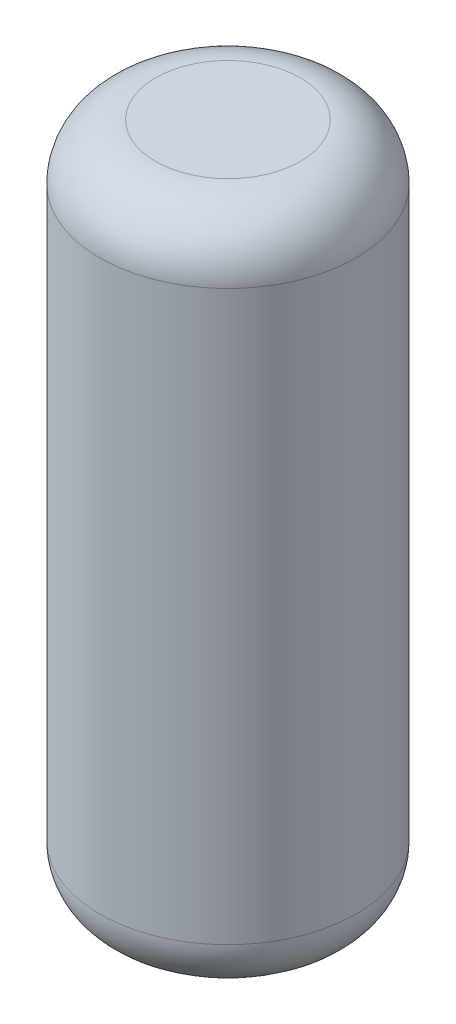
ISO-10303-21;
HEADER;
FILE_DESCRIPTION(('STEP AP214'),'2;1');
FILE_NAME('part.step','',(''),(''),'','','');
FILE_SCHEMA(('AUTOMOTIVE_DESIGN { 1 0 10303 214 1 1 1 1 }'));
ENDSEC;
DATA;
#1=APPLICATION_CONTEXT('core data for automotive mechanical design processes');
#2=APPLICATION_PROTOCOL_DEFINITION('international standard','automotive_design',2000,#1);
#3=PRODUCT_CONTEXT('',#1,'mechanical');
#4=PRODUCT('Part','Part','',(#3));
#5=PRODUCT_RELATED_PRODUCT_CATEGORY('part','',(#4));
#6=PRODUCT_DEFINITION_FORMATION('','',#4);
#7=PRODUCT_DEFINITION_CONTEXT('part definition',#1,'design');
#8=PRODUCT_DEFINITION('design','',#6,#7);
#9=PRODUCT_DEFINITION_SHAPE('','',#8);
#10=(LENGTH_UNIT() NAMED_UNIT(*) SI_UNIT(.MILLI.,.METRE.));
#11=(NAMED_UNIT(*) PLANE_ANGLE_UNIT() SI_UNIT($,.RADIAN.));
#12=(NAMED_UNIT(*) SI_UNIT($,.STERADIAN.) SOLID_ANGLE_UNIT());
#13=UNCERTAINTY_MEASURE_WITH_UNIT(LENGTH_MEASURE(1.E-05),#10,'distance_accuracy_value','');
#14=(GEOMETRIC_REPRESENTATION_CONTEXT(3) GLOBAL_UNCERTAINTY_ASSIGNED_CONTEXT((#13)) GLOBAL_UNIT_ASSIGNED_CONTEXT((#10,
#11,#12)) REPRESENTATION_CONTEXT('',''));
#15=CARTESIAN_POINT('',(0.,0.,0.));
#16=DIRECTION('',(0.,0.,1.));
#17=DIRECTION('',(1.,0.,0.));
#18=AXIS2_PLACEMENT_3D('',#15,#16,#17);
#19=CARTESIAN_POINT('',(0.,229.87,0.));
#20=DIRECTION('',(0.,1.,0.));
#21=DIRECTION('',(0.,0.,1.));
#22=AXIS2_PLACEMENT_3D('',#19,#20,#21);
#23=PLANE('',#22);
#24=CARTESIAN_POINT('',(0.,229.87,0.));
#25=DIRECTION('',(0.,-1.,0.));
#26=DIRECTION('',(0.,0.,-1.));
#27=AXIS2_PLACEMENT_3D('',#24,#25,#26);
#28=CIRCLE('',#27,49.5299999999998);
#29=CARTESIAN_POINT('',(0.,229.87,-49.5299999999998));
#30=VERTEX_POINT('',#29);
#31=EDGE_CURVE('E56',#30,#30,#28,.T.);
#32=ORIENTED_EDGE('',*,*,#31,.T.);
#33=EDGE_LOOP('',(#32));
#34=FACE_BOUND('',#33,.T.);
#35=ADVANCED_FACE('F33',(#34),#23,.F.);
#36=CARTESIAN_POINT('',(0.,194.31,0.));
#37=DIRECTION('',(0.,-1.,0.));
#38=DIRECTION('',(0.,0.,-1.));
#39=AXIS2_PLACEMENT_3D('',#36,#37,#38);
#40=TOROIDAL_SURFACE('',#39,49.53,35.56);
#41=ORIENTED_EDGE('',*,*,#31,.F.);
#42=EDGE_LOOP('',(#41));
#43=FACE_BOUND('',#42,.T.);
#44=CARTESIAN_POINT('',(0.,194.31,0.));
#45=DIRECTION('',(0.,-1.,0.));
#46=DIRECTION('',(0.,0.,-1.));
#47=AXIS2_PLACEMENT_3D('',#44,#45,#46);
#48=CIRCLE('',#47,85.09);
#49=CARTESIAN_POINT('',(0.,194.31,-85.09));
#50=VERTEX_POINT('',#49);
#51=EDGE_CURVE('E66',#50,#50,#48,.T.);
#52=ORIENTED_EDGE('',*,*,#51,.T.);
#53=EDGE_LOOP('',(#52));
#54=FACE_BOUND('',#53,.T.);
#55=ADVANCED_FACE('F109',(#43,#54),#40,.F.);
#56=CARTESIAN_POINT('',(0.,-232.41,0.));
#57=DIRECTION('',(0.,-1.,0.));
#58=DIRECTION('',(0.,0.,-1.));
#59=AXIS2_PLACEMENT_3D('',#56,#57,#58);
#60=CYLINDRICAL_SURFACE('',#59,85.09);
#61=ORIENTED_EDGE('',*,*,#51,.F.);
#62=EDGE_LOOP('',(#61));
#63=FACE_BOUND('',#62,.T.);
#64=CARTESIAN_POINT('',(0.,-194.31,0.));
#65=DIRECTION('',(0.,-1.,0.));
#66=DIRECTION('',(0.,0.,-1.));
#67=AXIS2_PLACEMENT_3D('',#64,#65,#66);
#68=CIRCLE('',#67,85.09);
#69=CARTESIAN_POINT('',(0.,-194.31,-85.09));
#70=VERTEX_POINT('',#69);
#71=EDGE_CURVE('E63',#70,#70,#68,.T.);
#72=ORIENTED_EDGE('',*,*,#71,.T.);
#73=EDGE_LOOP('',(#72));
#74=FACE_BOUND('',#73,.T.);
#75=ADVANCED_FACE('F115',(#63,#74),#60,.F.);
#76=CARTESIAN_POINT('',(0.,-194.31,0.));
#77=DIRECTION('',(0.,-1.,0.));
#78=DIRECTION('',(0.,0.,-1.));
#79=AXIS2_PLACEMENT_3D('',#76,#77,#78);
#80=TOROIDAL_SURFACE('',#79,49.53,35.56);
#81=ORIENTED_EDGE('',*,*,#71,.F.);
#82=EDGE_LOOP('',(#81));
#83=FACE_BOUND('',#82,.T.);
#84=CARTESIAN_POINT('',(0.,-229.87,0.));
#85=DIRECTION('',(0.,-1.,0.));
#86=DIRECTION('',(0.,0.,-1.));
#87=AXIS2_PLACEMENT_3D('',#84,#85,#86);
#88=CIRCLE('',#87,49.5299999999998);
#89=CARTESIAN_POINT('',(0.,-229.87,-49.5299999999998));
#90=VERTEX_POINT('',#89);
#91=EDGE_CURVE('E60',#90,#90,#88,.T.);
#92=ORIENTED_EDGE('',*,*,#91,.T.);
#93=EDGE_LOOP('',(#92));
#94=FACE_BOUND('',#93,.T.);
#95=ADVANCED_FACE('F122',(#83,#94),#80,.F.);
#96=CARTESIAN_POINT('',(0.,-229.87,0.));
#97=DIRECTION('',(0.,-1.,0.));
#98=DIRECTION('',(0.,0.,-1.));
#99=AXIS2_PLACEMENT_3D('',#96,#97,#98);
#100=PLANE('',#99);
#101=CARTESIAN_POINT('',(0.,-229.87,0.));
#102=DIRECTION('',(0.,-1.,0.));
#103=DIRECTION('',(0.,0.,-1.));
#104=AXIS2_PLACEMENT_3D('',#101,#102,#103);
#105=CIRCLE('',#104,10.16);
#106=CARTESIAN_POINT('',(0.,-229.87,10.16));
#107=VERTEX_POINT('',#106);
#108=EDGE_CURVE('E57',#107,#107,#105,.T.);
#109=ORIENTED_EDGE('',*,*,#108,.T.);
#110=EDGE_LOOP('',(#109));
#111=FACE_BOUND('',#110,.T.);
#112=ORIENTED_EDGE('',*,*,#91,.F.);
#113=EDGE_LOOP('',(#112));
#114=FACE_BOUND('',#113,.T.);
#115=ADVANCED_FACE('F126',(#111,#114),#100,.F.);
#116=CARTESIAN_POINT('',(0.,-251.46,0.));
#117=DIRECTION('',(0.,1.,0.));
#118=DIRECTION('',(0.,0.,1.));
#119=AXIS2_PLACEMENT_3D('',#116,#117,#118);
#120=CYLINDRICAL_SURFACE('',#119,10.16);
#121=CARTESIAN_POINT('',(0.,-232.41,0.));
#122=DIRECTION('',(0.,-1.,0.));
#123=DIRECTION('',(0.,0.,-1.));
#124=AXIS2_PLACEMENT_3D('',#121,#122,#123);
#125=CIRCLE('',#124,10.16);
#126=CARTESIAN_POINT('',(0.,-232.41,10.16));
#127=VERTEX_POINT('',#126);
#128=EDGE_CURVE('E37',#127,#127,#125,.T.);
#129=CARTESIAN_POINT('',(0.,-229.87,10.16));
#130=CARTESIAN_POINT('',(0.,-229.896458333333,10.16));
#131=CARTESIAN_POINT('',(0.,-229.922916666667,10.16));
#132=CARTESIAN_POINT('',(0.,-229.975833333333,10.16));
#133=CARTESIAN_POINT('',(0.,-230.002291666667,10.16));
#134=CARTESIAN_POINT('',(0.,-230.055208333333,10.16));
#135=CARTESIAN_POINT('',(0.,-230.081666666667,10.16));
#136=CARTESIAN_POINT('',(0.,-230.134583333333,10.16));
#137=CARTESIAN_POINT('',(0.,-230.161041666667,10.16));
#138=CARTESIAN_POINT('',(0.,-230.213958333333,10.16));
#139=CARTESIAN_POINT('',(0.,-230.240416666667,10.16));
#140=CARTESIAN_POINT('',(0.,-230.293333333333,10.16));
#141=CARTESIAN_POINT('',(0.,-230.319791666667,10.16));
#142=CARTESIAN_POINT('',(0.,-230.372708333333,10.16));
#143=CARTESIAN_POINT('',(0.,-230.399166666667,10.16));
#144=CARTESIAN_POINT('',(0.,-230.452083333333,10.16));
#145=CARTESIAN_POINT('',(0.,-230.478541666667,10.16));
#146=CARTESIAN_POINT('',(0.,-230.531458333333,10.16));
#147=CARTESIAN_POINT('',(0.,-230.557916666667,10.16));
#148=CARTESIAN_POINT('',(0.,-230.610833333333,10.16));
#149=CARTESIAN_POINT('',(0.,-230.637291666667,10.16));
#150=CARTESIAN_POINT('',(0.,-230.690208333333,10.16));
#151=CARTESIAN_POINT('',(0.,-230.716666666667,10.16));
#152=CARTESIAN_POINT('',(0.,-230.769583333333,10.16));
#153=CARTESIAN_POINT('',(0.,-230.796041666667,10.16));
#154=CARTESIAN_POINT('',(0.,-230.848958333333,10.16));
#155=CARTESIAN_POINT('',(0.,-230.875416666667,10.16));
#156=CARTESIAN_POINT('',(0.,-230.928333333333,10.16));
#157=CARTESIAN_POINT('',(0.,-230.954791666667,10.16));
#158=CARTESIAN_POINT('',(0.,-231.007708333333,10.16));
#159=CARTESIAN_POINT('',(0.,-231.034166666667,10.16));
#160=CARTESIAN_POINT('',(0.,-231.087083333333,10.16));
#161=CARTESIAN_POINT('',(0.,-231.113541666667,10.16));
#162=CARTESIAN_POINT('',(0.,-231.166458333333,10.16));
#163=CARTESIAN_POINT('',(0.,-231.192916666667,10.16));
#164=CARTESIAN_POINT('',(0.,-231.245833333333,10.16));
#165=CARTESIAN_POINT('',(0.,-231.272291666667,10.16));
#166=CARTESIAN_POINT('',(0.,-231.325208333333,10.16));
#167=CARTESIAN_POINT('',(0.,-231.351666666667,10.16));
#168=CARTESIAN_POINT('',(0.,-231.404583333333,10.16));
#169=CARTESIAN_POINT('',(0.,-231.431041666667,10.16));
#170=CARTESIAN_POINT('',(0.,-231.483958333333,10.16));
#171=CARTESIAN_POINT('',(0.,-231.510416666667,10.16));
#172=CARTESIAN_POINT('',(0.,-231.563333333333,10.16));
#173=CARTESIAN_POINT('',(0.,-231.589791666667,10.16));
#174=CARTESIAN_POINT('',(0.,-231.642708333333,10.16));
#175=CARTESIAN_POINT('',(0.,-231.669166666667,10.16));
#176=CARTESIAN_POINT('',(0.,-231.722083333333,10.16));
#177=CARTESIAN_POINT('',(0.,-231.748541666667,10.16));
#178=CARTESIAN_POINT('',(0.,-231.801458333333,10.16));
#179=CARTESIAN_POINT('',(0.,-231.827916666667,10.16));
#180=CARTESIAN_POINT('',(0.,-231.880833333333,10.16));
#181=CARTESIAN_POINT('',(0.,-231.907291666667,10.16));
#182=CARTESIAN_POINT('',(0.,-231.960208333333,10.16));
#183=CARTESIAN_POINT('',(0.,-231.986666666667,10.16));
#184=CARTESIAN_POINT('',(0.,-232.039583333333,10.16));
#185=CARTESIAN_POINT('',(0.,-232.066041666667,10.16));
#186=CARTESIAN_POINT('',(0.,-232.118958333333,10.16));
#187=CARTESIAN_POINT('',(0.,-232.145416666667,10.16));
#188=CARTESIAN_POINT('',(0.,-232.198333333333,10.16));
#189=CARTESIAN_POINT('',(0.,-232.224791666667,10.16));
#190=CARTESIAN_POINT('',(0.,-232.277708333333,10.16));
#191=CARTESIAN_POINT('',(0.,-232.304166666667,10.16));
#192=CARTESIAN_POINT('',(0.,-232.357083333333,10.16));
#193=CARTESIAN_POINT('',(0.,-232.383541666667,10.16));
#194=CARTESIAN_POINT('',(0.,-232.41,10.16));
#195=B_SPLINE_CURVE_WITH_KNOTS('',3,(#129,#130,#131,#132,#133,#134,#135,#136,#137,#138,#139,
#140,#141,#142,#143,#144,#145,#146,#147,#148,#149,#150,#151,#152,#153,#154,#155,#156,#157,#158,
#159,#160,#161,#162,#163,#164,#165,#166,#167,#168,#169,#170,#171,#172,#173,#174,#175,#176,#177,
#178,#179,#180,#181,#182,#183,#184,#185,#186,#187,#188,#189,#190,#191,#192,#193,#194),
.UNSPECIFIED.,.F.,.F.,(4,2,2,2,2,2,2,2,2,2,2,2,2,2,2,2,2,2,2,2,2,2,2,2,2,2,2,2,2,2,2,2,4),(0.,
0.0793750000000204,0.158750000000013,0.238125000000006,0.317499999999998,0.396875000000019,
0.476250000000011,0.555625000000004,0.635000000000024,0.714375000000017,0.79375000000001,
0.873125000000002,0.952500000000023,1.03187500000002,1.11125000000001,1.19062500000003,
1.27000000000002,1.34937500000001,1.42875000000003,1.50812500000003,1.58750000000002,
1.66687500000004,1.74625000000003,1.82562500000003,1.90500000000002,1.98437500000004,
2.06375000000003,2.14312500000002,2.22250000000004,2.30187500000004,2.38125000000003,
2.46062500000002,2.54000000000004),.UNSPECIFIED.);
#196=EDGE_CURVE('BSEAM129',#107,#127,#195,.T.);
#197=ORIENTED_EDGE('',*,*,#108,.F.);
#198=ORIENTED_EDGE('',*,*,#128,.T.);
#199=ORIENTED_EDGE('',*,*,#196,.T.);
#200=ORIENTED_EDGE('',*,*,#196,.F.);
#201=EDGE_LOOP('',(#197,#199,#198,#200));
#202=FACE_BOUND('',#201,.T.);
#203=ADVANCED_FACE('F129',(#202),#120,.F.);
#204=CARTESIAN_POINT('',(0.,-232.41,0.));
#205=DIRECTION('',(0.,-1.,0.));
#206=DIRECTION('',(0.,0.,-1.));
#207=AXIS2_PLACEMENT_3D('',#204,#205,#206);
#208=PLANE('',#207);
#209=CARTESIAN_POINT('',(0.,-232.41,0.));
#210=DIRECTION('',(0.,-1.,0.));
#211=DIRECTION('',(0.,0.,-1.));
#212=AXIS2_PLACEMENT_3D('',#209,#210,#211);
#213=CIRCLE('',#212,7.9375);
#214=CARTESIAN_POINT('',(0.,-232.41,-7.9375));
#215=VERTEX_POINT('',#214);
#216=EDGE_CURVE('E74',#215,#215,#213,.T.);
#217=ORIENTED_EDGE('',*,*,#216,.T.);
#218=EDGE_LOOP('',(#217));
#219=FACE_BOUND('',#218,.T.);
#220=ORIENTED_EDGE('',*,*,#128,.F.);
#221=EDGE_LOOP('',(#220));
#222=FACE_BOUND('',#221,.T.);
#223=ADVANCED_FACE('F81',(#219,#222),#208,.F.);
#224=CARTESIAN_POINT('',(0.,-232.41,0.));
#225=DIRECTION('',(0.,-1.,0.));
#226=DIRECTION('',(0.,0.,-1.));
#227=AXIS2_PLACEMENT_3D('',#224,#225,#226);
#228=CYLINDRICAL_SURFACE('',#227,7.9375);
#229=ORIENTED_EDGE('',*,*,#216,.F.);
#230=EDGE_LOOP('',(#229));
#231=FACE_BOUND('',#230,.T.);
#232=CARTESIAN_POINT('',(0.,-257.81,0.));
#233=DIRECTION('',(0.,-1.,0.));
#234=DIRECTION('',(0.,0.,-1.));
#235=AXIS2_PLACEMENT_3D('',#232,#233,#234);
#236=CIRCLE('',#235,7.9375);
#237=CARTESIAN_POINT('',(0.,-257.81,-7.9375));
#238=VERTEX_POINT('',#237);
#239=EDGE_CURVE('E75',#238,#238,#236,.T.);
#240=ORIENTED_EDGE('',*,*,#239,.T.);
#241=EDGE_LOOP('',(#240));
#242=FACE_BOUND('',#241,.T.);
#243=ADVANCED_FACE('F84',(#231,#242),#228,.F.);
#244=CARTESIAN_POINT('',(0.,232.41,0.));
#245=DIRECTION('',(0.,1.,0.));
#246=DIRECTION('',(0.,0.,1.));
#247=AXIS2_PLACEMENT_3D('',#244,#245,#246);
#248=PLANE('',#247);
#249=CARTESIAN_POINT('',(0.,232.41,0.));
#250=DIRECTION('',(0.,-1.,0.));
#251=DIRECTION('',(0.,0.,-1.));
#252=AXIS2_PLACEMENT_3D('',#249,#250,#251);
#253=CIRCLE('',#252,49.5299999999997);
#254=CARTESIAN_POINT('',(0.,232.41,-49.5299999999997));
#255=VERTEX_POINT('',#254);
#256=EDGE_CURVE('E10',#255,#255,#253,.T.);
#257=ORIENTED_EDGE('',*,*,#256,.F.);
#258=EDGE_LOOP('',(#257));
#259=FACE_BOUND('',#258,.T.);
#260=ADVANCED_FACE('F35',(#259),#248,.T.);
#261=CARTESIAN_POINT('',(0.,194.31,0.));
#262=DIRECTION('',(0.,-1.,0.));
#263=DIRECTION('',(0.,0.,-1.));
#264=AXIS2_PLACEMENT_3D('',#261,#262,#263);
#265=TOROIDAL_SURFACE('',#264,49.53,38.1);
#266=ORIENTED_EDGE('',*,*,#256,.T.);
#267=EDGE_LOOP('',(#266));
#268=FACE_BOUND('',#267,.T.);
#269=CARTESIAN_POINT('',(0.,194.31,0.));
#270=DIRECTION('',(0.,-1.,0.));
#271=DIRECTION('',(0.,0.,-1.));
#272=AXIS2_PLACEMENT_3D('',#269,#270,#271);
#273=CIRCLE('',#272,87.63);
#274=CARTESIAN_POINT('',(0.,194.31,-87.63));
#275=VERTEX_POINT('',#274);
#276=EDGE_CURVE('E41',#275,#275,#273,.T.);
#277=ORIENTED_EDGE('',*,*,#276,.F.);
#278=EDGE_LOOP('',(#277));
#279=FACE_BOUND('',#278,.T.);
#280=ADVANCED_FACE('F156',(#268,#279),#265,.T.);
#281=CARTESIAN_POINT('',(0.,-232.41,0.));
#282=DIRECTION('',(0.,-1.,0.));
#283=DIRECTION('',(0.,0.,-1.));
#284=AXIS2_PLACEMENT_3D('',#281,#282,#283);
#285=CYLINDRICAL_SURFACE('',#284,87.63);
#286=ORIENTED_EDGE('',*,*,#276,.T.);
#287=EDGE_LOOP('',(#286));
#288=FACE_BOUND('',#287,.T.);
#289=CARTESIAN_POINT('',(0.,-194.31,0.));
#290=DIRECTION('',(0.,-1.,0.));
#291=DIRECTION('',(0.,0.,-1.));
#292=AXIS2_PLACEMENT_3D('',#289,#290,#291);
#293=CIRCLE('',#292,87.63);
#294=CARTESIAN_POINT('',(0.,-194.31,-87.63));
#295=VERTEX_POINT('',#294);
#296=EDGE_CURVE('E45',#295,#295,#293,.T.);
#297=ORIENTED_EDGE('',*,*,#296,.F.);
#298=EDGE_LOOP('',(#297));
#299=FACE_BOUND('',#298,.T.);
#300=ADVANCED_FACE('F163',(#288,#299),#285,.T.);
#301=CARTESIAN_POINT('',(0.,-194.31,0.));
#302=DIRECTION('',(0.,-1.,0.));
#303=DIRECTION('',(0.,0.,-1.));
#304=AXIS2_PLACEMENT_3D('',#301,#302,#303);
#305=TOROIDAL_SURFACE('',#304,49.53,38.1);
#306=ORIENTED_EDGE('',*,*,#296,.T.);
#307=EDGE_LOOP('',(#306));
#308=FACE_BOUND('',#307,.T.);
#309=CARTESIAN_POINT('',(0.,-232.41,0.));
#310=DIRECTION('',(0.,-1.,0.));
#311=DIRECTION('',(0.,0.,-1.));
#312=AXIS2_PLACEMENT_3D('',#309,#310,#311);
#313=CIRCLE('',#312,49.5299999999998);
#314=CARTESIAN_POINT('',(0.,-232.41,-49.5299999999998));
#315=VERTEX_POINT('',#314);
#316=EDGE_CURVE('E50',#315,#315,#313,.T.);
#317=ORIENTED_EDGE('',*,*,#316,.F.);
#318=EDGE_LOOP('',(#317));
#319=FACE_BOUND('',#318,.T.);
#320=ADVANCED_FACE('F104',(#308,#319),#305,.T.);
#321=CARTESIAN_POINT('',(0.,-232.41,0.));
#322=DIRECTION('',(0.,-1.,0.));
#323=DIRECTION('',(0.,0.,-1.));
#324=AXIS2_PLACEMENT_3D('',#321,#322,#323);
#325=PLANE('',#324);
#326=CARTESIAN_POINT('',(0.,-232.41,0.));
#327=DIRECTION('',(0.,-1.,0.));
#328=DIRECTION('',(0.,0.,-1.));
#329=AXIS2_PLACEMENT_3D('',#326,#327,#328);
#330=CIRCLE('',#329,12.7);
#331=CARTESIAN_POINT('',(0.,-232.41,12.7));
#332=VERTEX_POINT('',#331);
#333=EDGE_CURVE('E53',#332,#332,#330,.T.);
#334=ORIENTED_EDGE('',*,*,#333,.F.);
#335=EDGE_LOOP('',(#334));
#336=FACE_BOUND('',#335,.T.);
#337=ORIENTED_EDGE('',*,*,#316,.T.);
#338=EDGE_LOOP('',(#337));
#339=FACE_BOUND('',#338,.T.);
#340=ADVANCED_FACE('F98',(#336,#339),#325,.T.);
#341=CARTESIAN_POINT('',(0.,-251.46,0.));
#342=DIRECTION('',(0.,1.,0.));
#343=DIRECTION('',(0.,0.,1.));
#344=AXIS2_PLACEMENT_3D('',#341,#342,#343);
#345=CYLINDRICAL_SURFACE('',#344,12.7);
#346=CARTESIAN_POINT('',(0.,-257.81,0.));
#347=DIRECTION('',(0.,-1.,0.));
#348=DIRECTION('',(0.,0.,-1.));
#349=AXIS2_PLACEMENT_3D('',#346,#347,#348);
#350=CIRCLE('',#349,12.7);
#351=CARTESIAN_POINT('',(0.,-257.81,12.7));
#352=VERTEX_POINT('',#351);
#353=EDGE_CURVE('E71',#352,#352,#350,.T.);
#354=CARTESIAN_POINT('',(0.,-232.41,12.7));
#355=CARTESIAN_POINT('',(0.,-232.674583333333,12.7));
#356=CARTESIAN_POINT('',(0.,-232.939166666667,12.7));
#357=CARTESIAN_POINT('',(0.,-233.468333333333,12.7));
#358=CARTESIAN_POINT('',(0.,-233.732916666667,12.7));
#359=CARTESIAN_POINT('',(0.,-234.262083333333,12.7));
#360=CARTESIAN_POINT('',(0.,-234.526666666667,12.7));
#361=CARTESIAN_POINT('',(0.,-235.055833333333,12.7));
#362=CARTESIAN_POINT('',(0.,-235.320416666667,12.7));
#363=CARTESIAN_POINT('',(0.,-235.849583333333,12.7));
#364=CARTESIAN_POINT('',(0.,-236.114166666667,12.7));
#365=CARTESIAN_POINT('',(0.,-236.643333333333,12.7));
#366=CARTESIAN_POINT('',(0.,-236.907916666667,12.7));
#367=CARTESIAN_POINT('',(0.,-237.437083333333,12.7));
#368=CARTESIAN_POINT('',(0.,-237.701666666667,12.7));
#369=CARTESIAN_POINT('',(0.,-238.230833333333,12.7));
#370=CARTESIAN_POINT('',(0.,-238.495416666667,12.7));
#371=CARTESIAN_POINT('',(0.,-239.024583333333,12.7));
#372=CARTESIAN_POINT('',(0.,-239.289166666667,12.7));
#373=CARTESIAN_POINT('',(0.,-239.818333333333,12.7));
#374=CARTESIAN_POINT('',(0.,-240.082916666667,12.7));
#375=CARTESIAN_POINT('',(0.,-240.612083333333,12.7));
#376=CARTESIAN_POINT('',(0.,-240.876666666667,12.7));
#377=CARTESIAN_POINT('',(0.,-241.405833333333,12.7));
#378=CARTESIAN_POINT('',(0.,-241.670416666667,12.7));
#379=CARTESIAN_POINT('',(0.,-242.199583333333,12.7));
#380=CARTESIAN_POINT('',(0.,-242.464166666667,12.7));
#381=CARTESIAN_POINT('',(0.,-242.993333333333,12.7));
#382=CARTESIAN_POINT('',(0.,-243.257916666667,12.7));
#383=CARTESIAN_POINT('',(0.,-243.787083333333,12.7));
#384=CARTESIAN_POINT('',(0.,-244.051666666667,12.7));
#385=CARTESIAN_POINT('',(0.,-244.580833333333,12.7));
#386=CARTESIAN_POINT('',(0.,-244.845416666667,12.7));
#387=CARTESIAN_POINT('',(0.,-245.374583333333,12.7));
#388=CARTESIAN_POINT('',(0.,-245.639166666667,12.7));
#389=CARTESIAN_POINT('',(0.,-246.168333333333,12.7));
#390=CARTESIAN_POINT('',(0.,-246.432916666667,12.7));
#391=CARTESIAN_POINT('',(0.,-246.962083333333,12.7));
#392=CARTESIAN_POINT('',(0.,-247.226666666667,12.7));
#393=CARTESIAN_POINT('',(0.,-247.755833333333,12.7));
#394=CARTESIAN_POINT('',(0.,-248.020416666667,12.7));
#395=CARTESIAN_POINT('',(0.,-248.549583333333,12.7));
#396=CARTESIAN_POINT('',(0.,-248.814166666667,12.7));
#397=CARTESIAN_POINT('',(0.,-249.343333333333,12.7));
#398=CARTESIAN_POINT('',(0.,-249.607916666667,12.7));
#399=CARTESIAN_POINT('',(0.,-250.137083333333,12.7));
#400=CARTESIAN_POINT('',(0.,-250.401666666667,12.7));
#401=CARTESIAN_POINT('',(0.,-250.930833333333,12.7));
#402=CARTESIAN_POINT('',(0.,-251.195416666667,12.7));
#403=CARTESIAN_POINT('',(0.,-251.724583333333,12.7));
#404=CARTESIAN_POINT('',(0.,-251.989166666667,12.7));
#405=CARTESIAN_POINT('',(0.,-252.518333333333,12.7));
#406=CARTESIAN_POINT('',(0.,-252.782916666667,12.7));
#407=CARTESIAN_POINT('',(0.,-253.312083333333,12.7));
#408=CARTESIAN_POINT('',(0.,-253.576666666667,12.7));
#409=CARTESIAN_POINT('',(0.,-254.105833333333,12.7));
#410=CARTESIAN_POINT('',(0.,-254.370416666667,12.7));
#411=CARTESIAN_POINT('',(0.,-254.899583333333,12.7));
#412=CARTESIAN_POINT('',(0.,-255.164166666667,12.7));
#413=CARTESIAN_POINT('',(0.,-255.693333333333,12.7));
#414=CARTESIAN_POINT('',(0.,-255.957916666667,12.7));
#415=CARTESIAN_POINT('',(0.,-256.487083333333,12.7));
#416=CARTESIAN_POINT('',(0.,-256.751666666667,12.7));
#417=CARTESIAN_POINT('',(0.,-257.280833333333,12.7));
#418=CARTESIAN_POINT('',(0.,-257.545416666667,12.7));
#419=CARTESIAN_POINT('',(0.,-257.81,12.7));
#420=B_SPLINE_CURVE_WITH_KNOTS('',3,(#354,#355,#356,#357,#358,#359,#360,#361,#362,#363,#364,
#365,#366,#367,#368,#369,#370,#371,#372,#373,#374,#375,#376,#377,#378,#379,#380,#381,#382,#383,
#384,#385,#386,#387,#388,#389,#390,#391,#392,#393,#394,#395,#396,#397,#398,#399,#400,#401,#402,
#403,#404,#405,#406,#407,#408,#409,#410,#411,#412,#413,#414,#415,#416,#417,#418,#419),
.UNSPECIFIED.,.F.,.F.,(4,2,2,2,2,2,2,2,2,2,2,2,2,2,2,2,2,2,2,2,2,2,2,2,2,2,2,2,2,2,2,2,4),(0.,
0.79375000000001,1.58750000000002,2.38125,3.17500000000001,3.96875000000002,4.7625,
5.55625000000001,6.35000000000002,7.14375,7.93750000000001,8.73125000000002,9.52500000000001,
10.31875,11.1125,11.90625,12.7,13.49375,14.2875,15.08125,15.875,16.66875,17.4625,18.25625,19.05,
19.84375,20.6375,21.43125,22.225,23.01875,23.8125,24.60625,25.4),.UNSPECIFIED.);
#421=EDGE_CURVE('BSEAM93',#332,#352,#420,.T.);
#422=ORIENTED_EDGE('',*,*,#333,.T.);
#423=ORIENTED_EDGE('',*,*,#353,.F.);
#424=ORIENTED_EDGE('',*,*,#421,.T.);
#425=ORIENTED_EDGE('',*,*,#421,.F.);
#426=EDGE_LOOP('',(#422,#424,#423,#425));
#427=FACE_BOUND('',#426,.T.);
#428=ADVANCED_FACE('F93',(#427),#345,.T.);
#429=CARTESIAN_POINT('',(0.,-257.81,0.));
#430=DIRECTION('',(0.,-1.,0.));
#431=DIRECTION('',(0.,0.,-1.));
#432=AXIS2_PLACEMENT_3D('',#429,#430,#431);
#433=PLANE('',#432);
#434=ORIENTED_EDGE('',*,*,#239,.F.);
#435=EDGE_LOOP('',(#434));
#436=FACE_BOUND('',#435,.T.);
#437=ORIENTED_EDGE('',*,*,#353,.T.);
#438=EDGE_LOOP('',(#437));
#439=FACE_BOUND('',#438,.T.);
#440=ADVANCED_FACE('F90',(#436,#439),#433,.T.);
#441=CLOSED_SHELL('',(#35,#55,#75,#95,#115,#203,#223,#243,#260,#280,#300,#320,#340,#428,#440));
#442=MANIFOLD_SOLID_BREP('B2',#441);
#443=ADVANCED_BREP_SHAPE_REPRESENTATION('',(#18,#442),#14);
#444=SHAPE_DEFINITION_REPRESENTATION(#9,#443);
ENDSEC;
END-ISO-10303-21;
